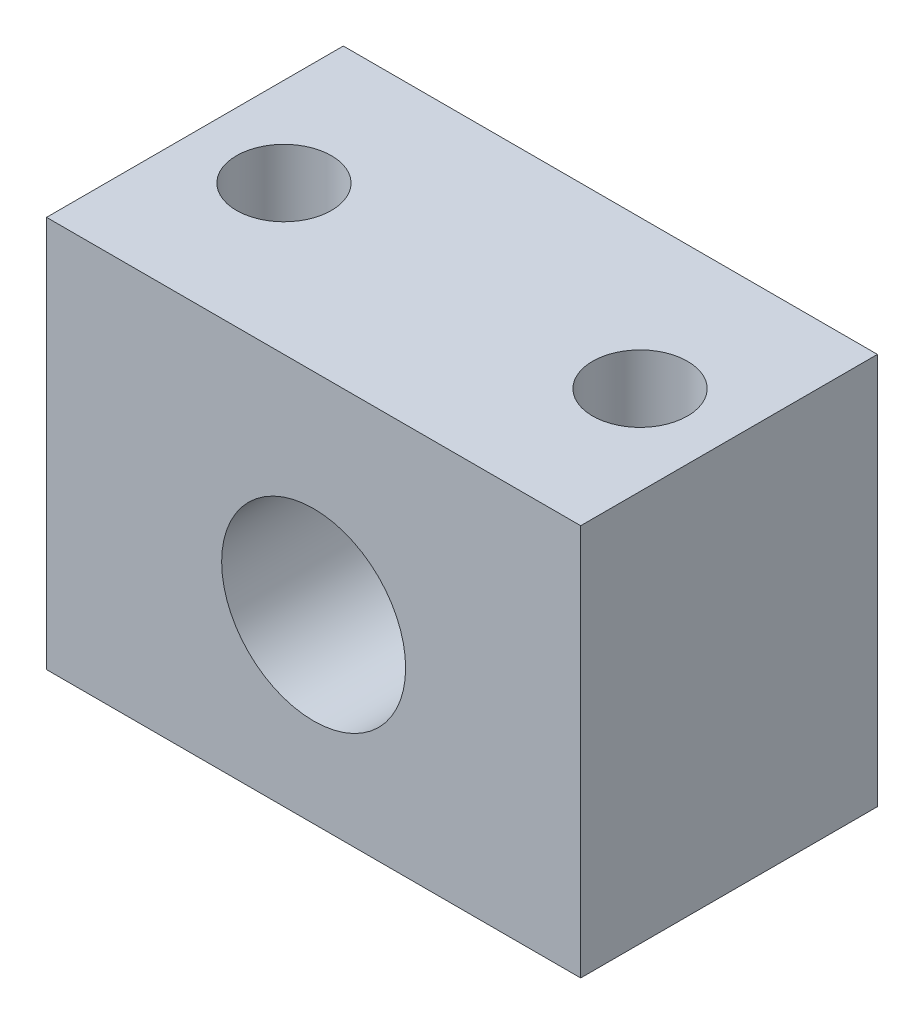
ISO-10303-21;
HEADER;
FILE_DESCRIPTION(('STEP AP214'),'2;1');
FILE_NAME('part.step','',(''),(''),'','','');
FILE_SCHEMA(('AUTOMOTIVE_DESIGN { 1 0 10303 214 1 1 1 1 }'));
ENDSEC;
DATA;
#1=APPLICATION_CONTEXT('core data for automotive mechanical design processes');
#2=APPLICATION_PROTOCOL_DEFINITION('international standard','automotive_design',2000,#1);
#3=PRODUCT_CONTEXT('',#1,'mechanical');
#4=PRODUCT('Part','Part','',(#3));
#5=PRODUCT_RELATED_PRODUCT_CATEGORY('part','',(#4));
#6=PRODUCT_DEFINITION_FORMATION('','',#4);
#7=PRODUCT_DEFINITION_CONTEXT('part definition',#1,'design');
#8=PRODUCT_DEFINITION('design','',#6,#7);
#9=PRODUCT_DEFINITION_SHAPE('','',#8);
#10=(LENGTH_UNIT() NAMED_UNIT(*) SI_UNIT(.MILLI.,.METRE.));
#11=(NAMED_UNIT(*) PLANE_ANGLE_UNIT() SI_UNIT($,.RADIAN.));
#12=(NAMED_UNIT(*) SI_UNIT($,.STERADIAN.) SOLID_ANGLE_UNIT());
#13=UNCERTAINTY_MEASURE_WITH_UNIT(LENGTH_MEASURE(1.E-05),#10,'distance_accuracy_value','');
#14=(GEOMETRIC_REPRESENTATION_CONTEXT(3) GLOBAL_UNCERTAINTY_ASSIGNED_CONTEXT((#13)) GLOBAL_UNIT_ASSIGNED_CONTEXT((#10,
#11,#12)) REPRESENTATION_CONTEXT('',''));
#15=CARTESIAN_POINT('',(0.,0.,0.));
#16=DIRECTION('',(0.,0.,1.));
#17=DIRECTION('',(1.,0.,0.));
#18=AXIS2_PLACEMENT_3D('',#15,#16,#17);
#19=CARTESIAN_POINT('',(0.,0.,10.));
#20=DIRECTION('',(0.,0.,1.));
#21=DIRECTION('',(1.,0.,0.));
#22=AXIS2_PLACEMENT_3D('',#19,#20,#21);
#23=PLANE('',#22);
#24=DIRECTION('',(0.,-1.,0.));
#25=VECTOR('',#24,1.);
#26=CARTESIAN_POINT('',(-9.,-6.1,10.));
#27=LINE('',#26,#25);
#28=CARTESIAN_POINT('',(-9.,7.1,10.));
#29=VERTEX_POINT('',#28);
#30=CARTESIAN_POINT('',(-9.,-6.1,10.));
#31=VERTEX_POINT('',#30);
#32=EDGE_CURVE('E88',#29,#31,#27,.T.);
#33=ORIENTED_EDGE('',*,*,#32,.T.);
#34=DIRECTION('',(1.,0.,0.));
#35=VECTOR('',#34,1.);
#36=CARTESIAN_POINT('',(9.,-6.1,10.));
#37=LINE('',#36,#35);
#38=CARTESIAN_POINT('',(9.,-6.1,10.));
#39=VERTEX_POINT('',#38);
#40=EDGE_CURVE('E83',#31,#39,#37,.T.);
#41=ORIENTED_EDGE('',*,*,#40,.T.);
#42=DIRECTION('',(0.,1.,0.));
#43=VECTOR('',#42,1.);
#44=CARTESIAN_POINT('',(9.,-6.1,10.));
#45=LINE('',#44,#43);
#46=CARTESIAN_POINT('',(9.,7.1,10.));
#47=VERTEX_POINT('',#46);
#48=EDGE_CURVE('E86',#39,#47,#45,.T.);
#49=ORIENTED_EDGE('',*,*,#48,.T.);
#50=DIRECTION('',(-1.,0.,0.));
#51=VECTOR('',#50,1.);
#52=CARTESIAN_POINT('',(9.,7.1,10.));
#53=LINE('',#52,#51);
#54=EDGE_CURVE('E53',#47,#29,#53,.T.);
#55=ORIENTED_EDGE('',*,*,#54,.T.);
#56=EDGE_LOOP('',(#33,#41,#49,#55));
#57=FACE_BOUND('',#56,.T.);
#58=CARTESIAN_POINT('',(0.,0.,10.));
#59=DIRECTION('',(0.,0.,1.));
#60=DIRECTION('',(1.,0.,0.));
#61=AXIS2_PLACEMENT_3D('',#58,#59,#60);
#62=CIRCLE('',#61,3.1);
#63=CARTESIAN_POINT('',(3.1,0.,10.));
#64=VERTEX_POINT('',#63);
#65=EDGE_CURVE('E103',#64,#64,#62,.T.);
#66=ORIENTED_EDGE('',*,*,#65,.F.);
#67=EDGE_LOOP('',(#66));
#68=FACE_BOUND('',#67,.T.);
#69=ADVANCED_FACE('F36',(#57,#68),#23,.T.);
#70=CARTESIAN_POINT('',(0.,0.,0.));
#71=DIRECTION('',(0.,0.,1.));
#72=DIRECTION('',(1.,0.,0.));
#73=AXIS2_PLACEMENT_3D('',#70,#71,#72);
#74=PLANE('',#73);
#75=DIRECTION('',(0.,-1.,0.));
#76=VECTOR('',#75,1.);
#77=CARTESIAN_POINT('',(-9.,-6.1,0.));
#78=LINE('',#77,#76);
#79=CARTESIAN_POINT('',(-9.,7.1,0.));
#80=VERTEX_POINT('',#79);
#81=CARTESIAN_POINT('',(-9.,-6.1,0.));
#82=VERTEX_POINT('',#81);
#83=EDGE_CURVE('E100',#80,#82,#78,.T.);
#84=ORIENTED_EDGE('',*,*,#83,.F.);
#85=DIRECTION('',(-1.,0.,0.));
#86=VECTOR('',#85,1.);
#87=CARTESIAN_POINT('',(9.,7.1,0.));
#88=LINE('',#87,#86);
#89=CARTESIAN_POINT('',(9.,7.1,0.));
#90=VERTEX_POINT('',#89);
#91=EDGE_CURVE('E76',#90,#80,#88,.T.);
#92=ORIENTED_EDGE('',*,*,#91,.F.);
#93=DIRECTION('',(0.,1.,0.));
#94=VECTOR('',#93,1.);
#95=CARTESIAN_POINT('',(9.,-6.1,0.));
#96=LINE('',#95,#94);
#97=CARTESIAN_POINT('',(9.,-6.1,0.));
#98=VERTEX_POINT('',#97);
#99=EDGE_CURVE('E70',#98,#90,#96,.T.);
#100=ORIENTED_EDGE('',*,*,#99,.F.);
#101=DIRECTION('',(1.,0.,0.));
#102=VECTOR('',#101,1.);
#103=CARTESIAN_POINT('',(9.,-6.1,0.));
#104=LINE('',#103,#102);
#105=EDGE_CURVE('E92',#82,#98,#104,.T.);
#106=ORIENTED_EDGE('',*,*,#105,.F.);
#107=EDGE_LOOP('',(#84,#92,#100,#106));
#108=FACE_BOUND('',#107,.T.);
#109=CARTESIAN_POINT('',(0.,0.,0.));
#110=DIRECTION('',(0.,0.,1.));
#111=DIRECTION('',(1.,0.,0.));
#112=AXIS2_PLACEMENT_3D('',#109,#110,#111);
#113=CIRCLE('',#112,3.1);
#114=CARTESIAN_POINT('',(3.1,0.,0.));
#115=VERTEX_POINT('',#114);
#116=EDGE_CURVE('E115',#115,#115,#113,.T.);
#117=ORIENTED_EDGE('',*,*,#116,.T.);
#118=EDGE_LOOP('',(#117));
#119=FACE_BOUND('',#118,.T.);
#120=ADVANCED_FACE('F111',(#108,#119),#74,.F.);
#121=CARTESIAN_POINT('',(-9.,-6.1,10.));
#122=DIRECTION('',(1.,0.,0.));
#123=DIRECTION('',(0.,0.,-1.));
#124=AXIS2_PLACEMENT_3D('',#121,#122,#123);
#125=PLANE('',#124);
#126=ORIENTED_EDGE('',*,*,#83,.T.);
#127=DIRECTION('',(0.,0.,-1.));
#128=VECTOR('',#127,1.);
#129=CARTESIAN_POINT('',(-9.,-6.1,10.));
#130=LINE('',#129,#128);
#131=EDGE_CURVE('E11',#31,#82,#130,.T.);
#132=ORIENTED_EDGE('',*,*,#131,.F.);
#133=ORIENTED_EDGE('',*,*,#32,.F.);
#134=DIRECTION('',(0.,0.,-1.));
#135=VECTOR('',#134,1.);
#136=CARTESIAN_POINT('',(-9.,7.1,10.));
#137=LINE('',#136,#135);
#138=EDGE_CURVE('E96',#29,#80,#137,.T.);
#139=ORIENTED_EDGE('',*,*,#138,.T.);
#140=EDGE_LOOP('',(#126,#132,#133,#139));
#141=FACE_BOUND('',#140,.T.);
#142=ADVANCED_FACE('F38',(#141),#125,.F.);
#143=CARTESIAN_POINT('',(9.,-6.1,10.));
#144=DIRECTION('',(0.,1.,0.));
#145=DIRECTION('',(-1.,0.,0.));
#146=AXIS2_PLACEMENT_3D('',#143,#144,#145);
#147=PLANE('',#146);
#148=ORIENTED_EDGE('',*,*,#105,.T.);
#149=DIRECTION('',(0.,0.,-1.));
#150=VECTOR('',#149,1.);
#151=CARTESIAN_POINT('',(9.,-6.1,10.));
#152=LINE('',#151,#150);
#153=EDGE_CURVE('E45',#39,#98,#152,.T.);
#154=ORIENTED_EDGE('',*,*,#153,.F.);
#155=ORIENTED_EDGE('',*,*,#40,.F.);
#156=ORIENTED_EDGE('',*,*,#131,.T.);
#157=EDGE_LOOP('',(#148,#154,#155,#156));
#158=FACE_BOUND('',#157,.T.);
#159=ADVANCED_FACE('F91',(#158),#147,.F.);
#160=CARTESIAN_POINT('',(9.,-6.1,10.));
#161=DIRECTION('',(-1.,0.,0.));
#162=DIRECTION('',(0.,0.,1.));
#163=AXIS2_PLACEMENT_3D('',#160,#161,#162);
#164=PLANE('',#163);
#165=ORIENTED_EDGE('',*,*,#99,.T.);
#166=DIRECTION('',(0.,0.,-1.));
#167=VECTOR('',#166,1.);
#168=CARTESIAN_POINT('',(9.,7.1,10.));
#169=LINE('',#168,#167);
#170=EDGE_CURVE('E93',#47,#90,#169,.T.);
#171=ORIENTED_EDGE('',*,*,#170,.F.);
#172=ORIENTED_EDGE('',*,*,#48,.F.);
#173=ORIENTED_EDGE('',*,*,#153,.T.);
#174=EDGE_LOOP('',(#165,#171,#172,#173));
#175=FACE_BOUND('',#174,.T.);
#176=ADVANCED_FACE('F94',(#175),#164,.F.);
#177=CARTESIAN_POINT('',(9.,7.1,10.));
#178=DIRECTION('',(0.,-1.,0.));
#179=DIRECTION('',(1.,0.,0.));
#180=AXIS2_PLACEMENT_3D('',#177,#178,#179);
#181=PLANE('',#180);
#182=CARTESIAN_POINT('',(-6.,7.1,5.));
#183=DIRECTION('',(0.,1.,0.));
#184=DIRECTION('',(-1.,0.,0.));
#185=AXIS2_PLACEMENT_3D('',#182,#183,#184);
#186=CIRCLE('',#185,1.6);
#187=CARTESIAN_POINT('',(-7.6,7.1,5.));
#188=VERTEX_POINT('',#187);
#189=EDGE_CURVE('E127',#188,#188,#186,.T.);
#190=ORIENTED_EDGE('',*,*,#189,.F.);
#191=EDGE_LOOP('',(#190));
#192=FACE_BOUND('',#191,.T.);
#193=CARTESIAN_POINT('',(6.,7.1,5.));
#194=DIRECTION('',(0.,1.,0.));
#195=DIRECTION('',(1.,0.,0.));
#196=AXIS2_PLACEMENT_3D('',#193,#194,#195);
#197=CIRCLE('',#196,1.6);
#198=CARTESIAN_POINT('',(7.6,7.1,5.));
#199=VERTEX_POINT('',#198);
#200=EDGE_CURVE('E121',#199,#199,#197,.T.);
#201=ORIENTED_EDGE('',*,*,#200,.F.);
#202=EDGE_LOOP('',(#201));
#203=FACE_BOUND('',#202,.T.);
#204=ORIENTED_EDGE('',*,*,#91,.T.);
#205=ORIENTED_EDGE('',*,*,#138,.F.);
#206=ORIENTED_EDGE('',*,*,#54,.F.);
#207=ORIENTED_EDGE('',*,*,#170,.T.);
#208=EDGE_LOOP('',(#204,#205,#206,#207));
#209=FACE_BOUND('',#208,.T.);
#210=ADVANCED_FACE('F108',(#192,#203,#209),#181,.F.);
#211=CARTESIAN_POINT('',(0.,0.,10.));
#212=DIRECTION('',(0.,0.,-1.));
#213=DIRECTION('',(-1.,0.,0.));
#214=AXIS2_PLACEMENT_3D('',#211,#212,#213);
#215=CYLINDRICAL_SURFACE('',#214,3.1);
#216=ORIENTED_EDGE('',*,*,#65,.T.);
#217=EDGE_LOOP('',(#216));
#218=FACE_BOUND('',#217,.T.);
#219=ORIENTED_EDGE('',*,*,#116,.F.);
#220=EDGE_LOOP('',(#219));
#221=FACE_BOUND('',#220,.T.);
#222=ADVANCED_FACE('F144',(#218,#221),#215,.F.);
#223=CARTESIAN_POINT('',(6.,-2.9,5.));
#224=DIRECTION('',(0.,1.,0.));
#225=DIRECTION('',(-1.,0.,0.));
#226=AXIS2_PLACEMENT_3D('',#223,#224,#225);
#227=CYLINDRICAL_SURFACE('',#226,1.6);
#228=CARTESIAN_POINT('',(6.,-2.9,5.));
#229=DIRECTION('',(0.,1.,0.));
#230=DIRECTION('',(1.,0.,0.));
#231=AXIS2_PLACEMENT_3D('',#228,#229,#230);
#232=CIRCLE('',#231,1.6);
#233=CARTESIAN_POINT('',(7.6,-2.9,5.));
#234=VERTEX_POINT('',#233);
#235=EDGE_CURVE('E124',#234,#234,#232,.T.);
#236=ORIENTED_EDGE('',*,*,#235,.F.);
#237=EDGE_LOOP('',(#236));
#238=FACE_BOUND('',#237,.T.);
#239=ORIENTED_EDGE('',*,*,#200,.T.);
#240=EDGE_LOOP('',(#239));
#241=FACE_BOUND('',#240,.T.);
#242=ADVANCED_FACE('F148',(#238,#241),#227,.F.);
#243=CARTESIAN_POINT('',(6.,-2.9,5.));
#244=DIRECTION('',(0.,-1.,0.));
#245=DIRECTION('',(1.,0.,0.));
#246=AXIS2_PLACEMENT_3D('',#243,#244,#245);
#247=PLANE('',#246);
#248=ORIENTED_EDGE('',*,*,#235,.T.);
#249=EDGE_LOOP('',(#248));
#250=FACE_BOUND('',#249,.T.);
#251=ADVANCED_FACE('F138',(#250),#247,.F.);
#252=CARTESIAN_POINT('',(-6.,-2.9,5.));
#253=DIRECTION('',(0.,1.,0.));
#254=DIRECTION('',(-1.,0.,0.));
#255=AXIS2_PLACEMENT_3D('',#252,#253,#254);
#256=CYLINDRICAL_SURFACE('',#255,1.6);
#257=CARTESIAN_POINT('',(-6.,-2.9,5.));
#258=DIRECTION('',(0.,1.,0.));
#259=DIRECTION('',(-1.,0.,0.));
#260=AXIS2_PLACEMENT_3D('',#257,#258,#259);
#261=CIRCLE('',#260,1.6);
#262=CARTESIAN_POINT('',(-7.6,-2.9,5.));
#263=VERTEX_POINT('',#262);
#264=EDGE_CURVE('E118',#263,#263,#261,.T.);
#265=ORIENTED_EDGE('',*,*,#264,.F.);
#266=EDGE_LOOP('',(#265));
#267=FACE_BOUND('',#266,.T.);
#268=ORIENTED_EDGE('',*,*,#189,.T.);
#269=EDGE_LOOP('',(#268));
#270=FACE_BOUND('',#269,.T.);
#271=ADVANCED_FACE('F135',(#267,#270),#256,.F.);
#272=CARTESIAN_POINT('',(-6.,-2.9,5.));
#273=DIRECTION('',(0.,1.,0.));
#274=DIRECTION('',(-1.,0.,0.));
#275=AXIS2_PLACEMENT_3D('',#272,#273,#274);
#276=PLANE('',#275);
#277=ORIENTED_EDGE('',*,*,#264,.T.);
#278=EDGE_LOOP('',(#277));
#279=FACE_BOUND('',#278,.T.);
#280=ADVANCED_FACE('F133',(#279),#276,.T.);
#281=CLOSED_SHELL('',(#69,#120,#142,#159,#176,#210,#222,#242,#251,#271,#280));
#282=MANIFOLD_SOLID_BREP('B2',#281);
#283=ADVANCED_BREP_SHAPE_REPRESENTATION('',(#18,#282),#14);
#284=SHAPE_DEFINITION_REPRESENTATION(#9,#283);
ENDSEC;
END-ISO-10303-21;
